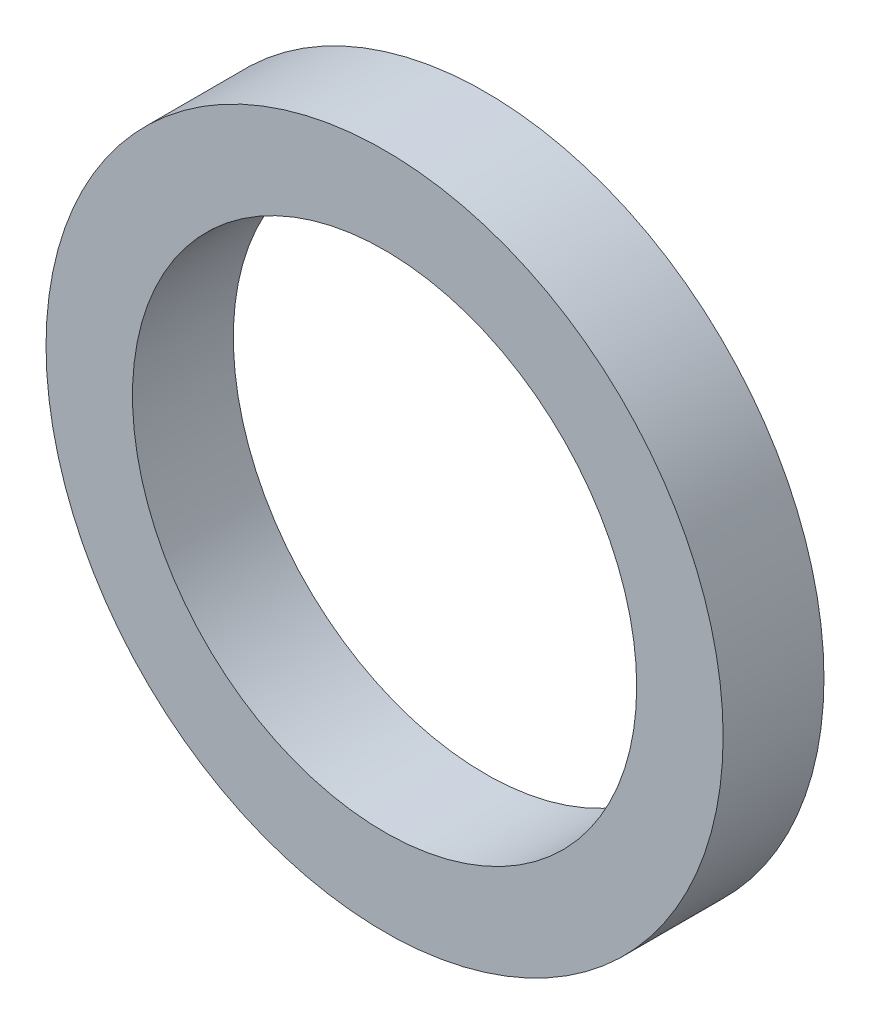
ISO-10303-21;
HEADER;
FILE_DESCRIPTION(('STEP AP214'),'2;1');
FILE_NAME('part.step','',(''),(''),'','','');
FILE_SCHEMA(('AUTOMOTIVE_DESIGN { 1 0 10303 214 1 1 1 1 }'));
ENDSEC;
DATA;
#1=APPLICATION_CONTEXT('core data for automotive mechanical design processes');
#2=APPLICATION_PROTOCOL_DEFINITION('international standard','automotive_design',2000,#1);
#3=PRODUCT_CONTEXT('',#1,'mechanical');
#4=PRODUCT('Part','Part','',(#3));
#5=PRODUCT_RELATED_PRODUCT_CATEGORY('part','',(#4));
#6=PRODUCT_DEFINITION_FORMATION('','',#4);
#7=PRODUCT_DEFINITION_CONTEXT('part definition',#1,'design');
#8=PRODUCT_DEFINITION('design','',#6,#7);
#9=PRODUCT_DEFINITION_SHAPE('','',#8);
#10=(LENGTH_UNIT() NAMED_UNIT(*) SI_UNIT(.MILLI.,.METRE.));
#11=(NAMED_UNIT(*) PLANE_ANGLE_UNIT() SI_UNIT($,.RADIAN.));
#12=(NAMED_UNIT(*) SI_UNIT($,.STERADIAN.) SOLID_ANGLE_UNIT());
#13=UNCERTAINTY_MEASURE_WITH_UNIT(LENGTH_MEASURE(1.E-05),#10,'distance_accuracy_value','');
#14=(GEOMETRIC_REPRESENTATION_CONTEXT(3) GLOBAL_UNCERTAINTY_ASSIGNED_CONTEXT((#13)) GLOBAL_UNIT_ASSIGNED_CONTEXT((#10,
#11,#12)) REPRESENTATION_CONTEXT('',''));
#15=CARTESIAN_POINT('',(0.,0.,0.));
#16=DIRECTION('',(0.,0.,1.));
#17=DIRECTION('',(1.,0.,0.));
#18=AXIS2_PLACEMENT_3D('',#15,#16,#17);
#19=CARTESIAN_POINT('',(0.,0.,7.));
#20=DIRECTION('',(0.,0.,1.));
#21=DIRECTION('',(1.,0.,0.));
#22=AXIS2_PLACEMENT_3D('',#19,#20,#21);
#23=PLANE('',#22);
#24=CARTESIAN_POINT('',(0.,0.,7.));
#25=DIRECTION('',(0.,0.,1.));
#26=DIRECTION('',(1.,0.,0.));
#27=AXIS2_PLACEMENT_3D('',#24,#25,#26);
#28=CIRCLE('',#27,23.5);
#29=CARTESIAN_POINT('',(23.5,0.,7.));
#30=VERTEX_POINT('',#29);
#31=EDGE_CURVE('E10',#30,#30,#28,.T.);
#32=ORIENTED_EDGE('',*,*,#31,.T.);
#33=EDGE_LOOP('',(#32));
#34=FACE_BOUND('',#33,.T.);
#35=CARTESIAN_POINT('',(0.,0.,7.));
#36=DIRECTION('',(0.,0.,1.));
#37=DIRECTION('',(1.,0.,0.));
#38=AXIS2_PLACEMENT_3D('',#35,#36,#37);
#39=CIRCLE('',#38,17.5);
#40=CARTESIAN_POINT('',(17.5,0.,7.));
#41=VERTEX_POINT('',#40);
#42=EDGE_CURVE('E43',#41,#41,#39,.T.);
#43=ORIENTED_EDGE('',*,*,#42,.F.);
#44=EDGE_LOOP('',(#43));
#45=FACE_BOUND('',#44,.T.);
#46=ADVANCED_FACE('F32',(#34,#45),#23,.T.);
#47=CARTESIAN_POINT('',(0.,0.,0.));
#48=DIRECTION('',(0.,0.,1.));
#49=DIRECTION('',(1.,0.,0.));
#50=AXIS2_PLACEMENT_3D('',#47,#48,#49);
#51=PLANE('',#50);
#52=CARTESIAN_POINT('',(0.,0.,0.));
#53=DIRECTION('',(0.,0.,1.));
#54=DIRECTION('',(1.,0.,0.));
#55=AXIS2_PLACEMENT_3D('',#52,#53,#54);
#56=CIRCLE('',#55,23.5);
#57=CARTESIAN_POINT('',(23.5,0.,0.));
#58=VERTEX_POINT('',#57);
#59=EDGE_CURVE('E36',#58,#58,#56,.T.);
#60=ORIENTED_EDGE('',*,*,#59,.F.);
#61=EDGE_LOOP('',(#60));
#62=FACE_BOUND('',#61,.T.);
#63=CARTESIAN_POINT('',(0.,0.,0.));
#64=DIRECTION('',(0.,0.,1.));
#65=DIRECTION('',(1.,0.,0.));
#66=AXIS2_PLACEMENT_3D('',#63,#64,#65);
#67=CIRCLE('',#66,17.5);
#68=CARTESIAN_POINT('',(17.5,0.,0.));
#69=VERTEX_POINT('',#68);
#70=EDGE_CURVE('E45',#69,#69,#67,.T.);
#71=ORIENTED_EDGE('',*,*,#70,.T.);
#72=EDGE_LOOP('',(#71));
#73=FACE_BOUND('',#72,.T.);
#74=ADVANCED_FACE('F55',(#62,#73),#51,.F.);
#75=CARTESIAN_POINT('',(0.,0.,7.));
#76=DIRECTION('',(0.,0.,-1.));
#77=DIRECTION('',(-1.,0.,0.));
#78=AXIS2_PLACEMENT_3D('',#75,#76,#77);
#79=CYLINDRICAL_SURFACE('',#78,23.5);
#80=ORIENTED_EDGE('',*,*,#31,.F.);
#81=EDGE_LOOP('',(#80));
#82=FACE_BOUND('',#81,.T.);
#83=ORIENTED_EDGE('',*,*,#59,.T.);
#84=EDGE_LOOP('',(#83));
#85=FACE_BOUND('',#84,.T.);
#86=ADVANCED_FACE('F34',(#82,#85),#79,.T.);
#87=CARTESIAN_POINT('',(0.,0.,7.));
#88=DIRECTION('',(0.,0.,-1.));
#89=DIRECTION('',(-1.,0.,0.));
#90=AXIS2_PLACEMENT_3D('',#87,#88,#89);
#91=CYLINDRICAL_SURFACE('',#90,17.5);
#92=ORIENTED_EDGE('',*,*,#42,.T.);
#93=EDGE_LOOP('',(#92));
#94=FACE_BOUND('',#93,.T.);
#95=ORIENTED_EDGE('',*,*,#70,.F.);
#96=EDGE_LOOP('',(#95));
#97=FACE_BOUND('',#96,.T.);
#98=ADVANCED_FACE('F51',(#94,#97),#91,.F.);
#99=CLOSED_SHELL('',(#46,#74,#86,#98));
#100=MANIFOLD_SOLID_BREP('B2',#99);
#101=ADVANCED_BREP_SHAPE_REPRESENTATION('',(#18,#100),#14);
#102=SHAPE_DEFINITION_REPRESENTATION(#9,#101);
ENDSEC;
END-ISO-10303-21;
